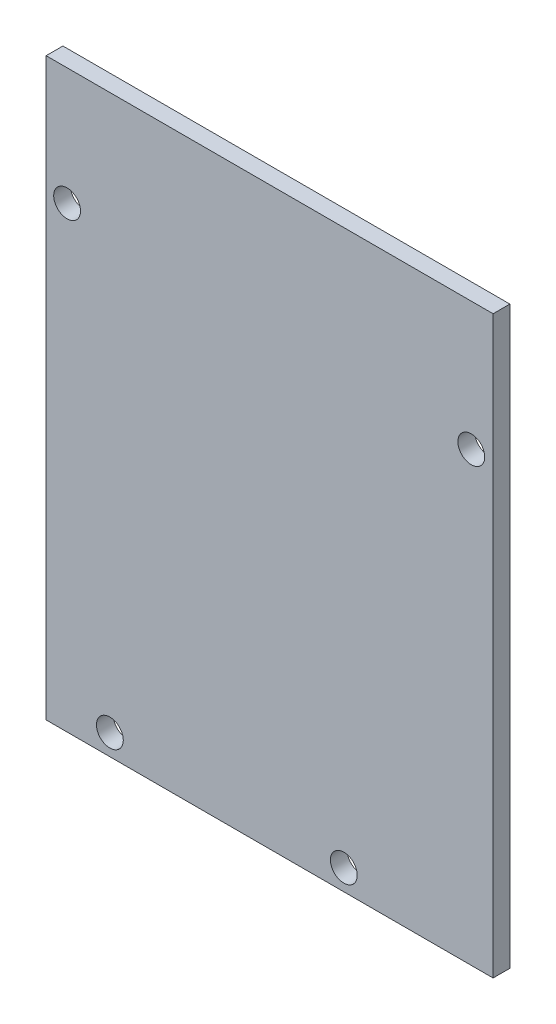
ISO-10303-21;
HEADER;
FILE_DESCRIPTION(('STEP AP214'),'2;1');
FILE_NAME('part.step','',(''),(''),'','','');
FILE_SCHEMA(('AUTOMOTIVE_DESIGN { 1 0 10303 214 1 1 1 1 }'));
ENDSEC;
DATA;
#1=APPLICATION_CONTEXT('core data for automotive mechanical design processes');
#2=APPLICATION_PROTOCOL_DEFINITION('international standard','automotive_design',2000,#1);
#3=PRODUCT_CONTEXT('',#1,'mechanical');
#4=PRODUCT('Part','Part','',(#3));
#5=PRODUCT_RELATED_PRODUCT_CATEGORY('part','',(#4));
#6=PRODUCT_DEFINITION_FORMATION('','',#4);
#7=PRODUCT_DEFINITION_CONTEXT('part definition',#1,'design');
#8=PRODUCT_DEFINITION('design','',#6,#7);
#9=PRODUCT_DEFINITION_SHAPE('','',#8);
#10=(LENGTH_UNIT() NAMED_UNIT(*) SI_UNIT(.MILLI.,.METRE.));
#11=(NAMED_UNIT(*) PLANE_ANGLE_UNIT() SI_UNIT($,.RADIAN.));
#12=(NAMED_UNIT(*) SI_UNIT($,.STERADIAN.) SOLID_ANGLE_UNIT());
#13=UNCERTAINTY_MEASURE_WITH_UNIT(LENGTH_MEASURE(1.E-05),#10,'distance_accuracy_value','');
#14=(GEOMETRIC_REPRESENTATION_CONTEXT(3) GLOBAL_UNCERTAINTY_ASSIGNED_CONTEXT((#13)) GLOBAL_UNIT_ASSIGNED_CONTEXT((#10,
#11,#12)) REPRESENTATION_CONTEXT('',''));
#15=CARTESIAN_POINT('',(0.,0.,0.));
#16=DIRECTION('',(0.,0.,1.));
#17=DIRECTION('',(1.,0.,0.));
#18=AXIS2_PLACEMENT_3D('',#15,#16,#17);
#19=CARTESIAN_POINT('',(-26.65,34.3,2.));
#20=DIRECTION('',(0.,0.,-1.));
#21=DIRECTION('',(-1.,0.,0.));
#22=AXIS2_PLACEMENT_3D('',#19,#20,#21);
#23=PLANE('',#22);
#24=CARTESIAN_POINT('',(24.05,19.,2.));
#25=DIRECTION('',(0.,0.,1.));
#26=DIRECTION('',(1.,0.,0.));
#27=AXIS2_PLACEMENT_3D('',#24,#25,#26);
#28=CIRCLE('',#27,1.6);
#29=CARTESIAN_POINT('',(25.65,19.,2.));
#30=VERTEX_POINT('',#29);
#31=EDGE_CURVE('E121',#30,#30,#28,.T.);
#32=ORIENTED_EDGE('',*,*,#31,.F.);
#33=EDGE_LOOP('',(#32));
#34=FACE_BOUND('',#33,.T.);
#35=CARTESIAN_POINT('',(-19.05,-31.8,2.));
#36=DIRECTION('',(0.,0.,1.));
#37=DIRECTION('',(1.,0.,0.));
#38=AXIS2_PLACEMENT_3D('',#35,#36,#37);
#39=CIRCLE('',#38,1.6);
#40=CARTESIAN_POINT('',(-17.45,-31.8,2.));
#41=VERTEX_POINT('',#40);
#42=EDGE_CURVE('E100',#41,#41,#39,.T.);
#43=ORIENTED_EDGE('',*,*,#42,.F.);
#44=EDGE_LOOP('',(#43));
#45=FACE_BOUND('',#44,.T.);
#46=DIRECTION('',(0.,-1.,0.));
#47=VECTOR('',#46,1.);
#48=CARTESIAN_POINT('',(-26.65,-34.3,2.));
#49=LINE('',#48,#47);
#50=CARTESIAN_POINT('',(-26.65,34.3,2.));
#51=VERTEX_POINT('',#50);
#52=CARTESIAN_POINT('',(-26.65,-34.3,2.));
#53=VERTEX_POINT('',#52);
#54=EDGE_CURVE('E85',#51,#53,#49,.T.);
#55=ORIENTED_EDGE('',*,*,#54,.T.);
#56=DIRECTION('',(1.,0.,0.));
#57=VECTOR('',#56,1.);
#58=CARTESIAN_POINT('',(-26.65,-34.3,2.));
#59=LINE('',#58,#57);
#60=CARTESIAN_POINT('',(26.65,-34.3,2.));
#61=VERTEX_POINT('',#60);
#62=EDGE_CURVE('E80',#53,#61,#59,.T.);
#63=ORIENTED_EDGE('',*,*,#62,.T.);
#64=DIRECTION('',(0.,1.,0.));
#65=VECTOR('',#64,1.);
#66=CARTESIAN_POINT('',(26.65,-34.3,2.));
#67=LINE('',#66,#65);
#68=CARTESIAN_POINT('',(26.65,34.3,2.));
#69=VERTEX_POINT('',#68);
#70=EDGE_CURVE('E83',#61,#69,#67,.T.);
#71=ORIENTED_EDGE('',*,*,#70,.T.);
#72=DIRECTION('',(-1.,0.,0.));
#73=VECTOR('',#72,1.);
#74=CARTESIAN_POINT('',(-26.65,34.3,2.));
#75=LINE('',#74,#73);
#76=EDGE_CURVE('E50',#69,#51,#75,.T.);
#77=ORIENTED_EDGE('',*,*,#76,.T.);
#78=EDGE_LOOP('',(#55,#63,#71,#77));
#79=FACE_BOUND('',#78,.T.);
#80=CARTESIAN_POINT('',(-24.15,20.3,2.));
#81=DIRECTION('',(0.,0.,1.));
#82=DIRECTION('',(1.,0.,0.));
#83=AXIS2_PLACEMENT_3D('',#80,#81,#82);
#84=CIRCLE('',#83,1.6);
#85=CARTESIAN_POINT('',(-22.55,20.3,2.));
#86=VERTEX_POINT('',#85);
#87=EDGE_CURVE('E115',#86,#86,#84,.T.);
#88=ORIENTED_EDGE('',*,*,#87,.F.);
#89=EDGE_LOOP('',(#88));
#90=FACE_BOUND('',#89,.T.);
#91=CARTESIAN_POINT('',(8.85,-31.8,2.));
#92=DIRECTION('',(0.,0.,1.));
#93=DIRECTION('',(1.,0.,0.));
#94=AXIS2_PLACEMENT_3D('',#91,#92,#93);
#95=CIRCLE('',#94,1.6);
#96=CARTESIAN_POINT('',(10.45,-31.8,2.));
#97=VERTEX_POINT('',#96);
#98=EDGE_CURVE('E127',#97,#97,#95,.T.);
#99=ORIENTED_EDGE('',*,*,#98,.F.);
#100=EDGE_LOOP('',(#99));
#101=FACE_BOUND('',#100,.T.);
#102=ADVANCED_FACE('F33',(#34,#45,#79,#90,#101),#23,.F.);
#103=CARTESIAN_POINT('',(-26.65,34.3,0.));
#104=DIRECTION('',(0.,0.,-1.));
#105=DIRECTION('',(-1.,0.,0.));
#106=AXIS2_PLACEMENT_3D('',#103,#104,#105);
#107=PLANE('',#106);
#108=CARTESIAN_POINT('',(24.05,19.,0.));
#109=DIRECTION('',(0.,0.,1.));
#110=DIRECTION('',(1.,0.,0.));
#111=AXIS2_PLACEMENT_3D('',#108,#109,#110);
#112=CIRCLE('',#111,1.6);
#113=CARTESIAN_POINT('',(25.65,19.,0.));
#114=VERTEX_POINT('',#113);
#115=EDGE_CURVE('E124',#114,#114,#112,.T.);
#116=ORIENTED_EDGE('',*,*,#115,.T.);
#117=EDGE_LOOP('',(#116));
#118=FACE_BOUND('',#117,.T.);
#119=CARTESIAN_POINT('',(-19.05,-31.8,0.));
#120=DIRECTION('',(0.,0.,1.));
#121=DIRECTION('',(1.,0.,0.));
#122=AXIS2_PLACEMENT_3D('',#119,#120,#121);
#123=CIRCLE('',#122,1.6);
#124=CARTESIAN_POINT('',(-17.45,-31.8,0.));
#125=VERTEX_POINT('',#124);
#126=EDGE_CURVE('E112',#125,#125,#123,.T.);
#127=ORIENTED_EDGE('',*,*,#126,.T.);
#128=EDGE_LOOP('',(#127));
#129=FACE_BOUND('',#128,.T.);
#130=DIRECTION('',(0.,-1.,0.));
#131=VECTOR('',#130,1.);
#132=CARTESIAN_POINT('',(-26.65,-34.3,0.));
#133=LINE('',#132,#131);
#134=CARTESIAN_POINT('',(-26.65,34.3,0.));
#135=VERTEX_POINT('',#134);
#136=CARTESIAN_POINT('',(-26.65,-34.3,0.));
#137=VERTEX_POINT('',#136);
#138=EDGE_CURVE('E97',#135,#137,#133,.T.);
#139=ORIENTED_EDGE('',*,*,#138,.F.);
#140=DIRECTION('',(-1.,0.,0.));
#141=VECTOR('',#140,1.);
#142=CARTESIAN_POINT('',(-26.65,34.3,0.));
#143=LINE('',#142,#141);
#144=CARTESIAN_POINT('',(26.65,34.3,0.));
#145=VERTEX_POINT('',#144);
#146=EDGE_CURVE('E73',#145,#135,#143,.T.);
#147=ORIENTED_EDGE('',*,*,#146,.F.);
#148=DIRECTION('',(0.,1.,0.));
#149=VECTOR('',#148,1.);
#150=CARTESIAN_POINT('',(26.65,-34.3,0.));
#151=LINE('',#150,#149);
#152=CARTESIAN_POINT('',(26.65,-34.3,0.));
#153=VERTEX_POINT('',#152);
#154=EDGE_CURVE('E67',#153,#145,#151,.T.);
#155=ORIENTED_EDGE('',*,*,#154,.F.);
#156=DIRECTION('',(1.,0.,0.));
#157=VECTOR('',#156,1.);
#158=CARTESIAN_POINT('',(-26.65,-34.3,0.));
#159=LINE('',#158,#157);
#160=EDGE_CURVE('E89',#137,#153,#159,.T.);
#161=ORIENTED_EDGE('',*,*,#160,.F.);
#162=EDGE_LOOP('',(#139,#147,#155,#161));
#163=FACE_BOUND('',#162,.T.);
#164=CARTESIAN_POINT('',(-24.15,20.3,0.));
#165=DIRECTION('',(0.,0.,1.));
#166=DIRECTION('',(1.,0.,0.));
#167=AXIS2_PLACEMENT_3D('',#164,#165,#166);
#168=CIRCLE('',#167,1.6);
#169=CARTESIAN_POINT('',(-22.55,20.3,0.));
#170=VERTEX_POINT('',#169);
#171=EDGE_CURVE('E118',#170,#170,#168,.T.);
#172=ORIENTED_EDGE('',*,*,#171,.T.);
#173=EDGE_LOOP('',(#172));
#174=FACE_BOUND('',#173,.T.);
#175=CARTESIAN_POINT('',(8.85,-31.8,0.));
#176=DIRECTION('',(0.,0.,1.));
#177=DIRECTION('',(1.,0.,0.));
#178=AXIS2_PLACEMENT_3D('',#175,#176,#177);
#179=CIRCLE('',#178,1.6);
#180=CARTESIAN_POINT('',(10.45,-31.8,0.));
#181=VERTEX_POINT('',#180);
#182=EDGE_CURVE('E130',#181,#181,#179,.T.);
#183=ORIENTED_EDGE('',*,*,#182,.T.);
#184=EDGE_LOOP('',(#183));
#185=FACE_BOUND('',#184,.T.);
#186=ADVANCED_FACE('F108',(#118,#129,#163,#174,#185),#107,.T.);
#187=CARTESIAN_POINT('',(-26.65,-34.3,2.));
#188=DIRECTION('',(1.,0.,0.));
#189=DIRECTION('',(0.,0.,-1.));
#190=AXIS2_PLACEMENT_3D('',#187,#188,#189);
#191=PLANE('',#190);
#192=ORIENTED_EDGE('',*,*,#138,.T.);
#193=DIRECTION('',(0.,0.,-1.));
#194=VECTOR('',#193,1.);
#195=CARTESIAN_POINT('',(-26.65,-34.3,2.));
#196=LINE('',#195,#194);
#197=EDGE_CURVE('E11',#53,#137,#196,.T.);
#198=ORIENTED_EDGE('',*,*,#197,.F.);
#199=ORIENTED_EDGE('',*,*,#54,.F.);
#200=DIRECTION('',(0.,0.,-1.));
#201=VECTOR('',#200,1.);
#202=CARTESIAN_POINT('',(-26.65,34.3,2.));
#203=LINE('',#202,#201);
#204=EDGE_CURVE('E93',#51,#135,#203,.T.);
#205=ORIENTED_EDGE('',*,*,#204,.T.);
#206=EDGE_LOOP('',(#192,#198,#199,#205));
#207=FACE_BOUND('',#206,.T.);
#208=ADVANCED_FACE('F35',(#207),#191,.F.);
#209=CARTESIAN_POINT('',(-26.65,-34.3,2.));
#210=DIRECTION('',(0.,1.,0.));
#211=DIRECTION('',(0.,0.,1.));
#212=AXIS2_PLACEMENT_3D('',#209,#210,#211);
#213=PLANE('',#212);
#214=ORIENTED_EDGE('',*,*,#160,.T.);
#215=DIRECTION('',(0.,0.,-1.));
#216=VECTOR('',#215,1.);
#217=CARTESIAN_POINT('',(26.65,-34.3,2.));
#218=LINE('',#217,#216);
#219=EDGE_CURVE('E42',#61,#153,#218,.T.);
#220=ORIENTED_EDGE('',*,*,#219,.F.);
#221=ORIENTED_EDGE('',*,*,#62,.F.);
#222=ORIENTED_EDGE('',*,*,#197,.T.);
#223=EDGE_LOOP('',(#214,#220,#221,#222));
#224=FACE_BOUND('',#223,.T.);
#225=ADVANCED_FACE('F88',(#224),#213,.F.);
#226=CARTESIAN_POINT('',(26.65,-34.3,2.));
#227=DIRECTION('',(-1.,0.,0.));
#228=DIRECTION('',(0.,0.,1.));
#229=AXIS2_PLACEMENT_3D('',#226,#227,#228);
#230=PLANE('',#229);
#231=ORIENTED_EDGE('',*,*,#154,.T.);
#232=DIRECTION('',(0.,0.,-1.));
#233=VECTOR('',#232,1.);
#234=CARTESIAN_POINT('',(26.65,34.3,2.));
#235=LINE('',#234,#233);
#236=EDGE_CURVE('E90',#69,#145,#235,.T.);
#237=ORIENTED_EDGE('',*,*,#236,.F.);
#238=ORIENTED_EDGE('',*,*,#70,.F.);
#239=ORIENTED_EDGE('',*,*,#219,.T.);
#240=EDGE_LOOP('',(#231,#237,#238,#239));
#241=FACE_BOUND('',#240,.T.);
#242=ADVANCED_FACE('F91',(#241),#230,.F.);
#243=CARTESIAN_POINT('',(-26.65,34.3,2.));
#244=DIRECTION('',(0.,-1.,0.));
#245=DIRECTION('',(0.,0.,-1.));
#246=AXIS2_PLACEMENT_3D('',#243,#244,#245);
#247=PLANE('',#246);
#248=ORIENTED_EDGE('',*,*,#146,.T.);
#249=ORIENTED_EDGE('',*,*,#204,.F.);
#250=ORIENTED_EDGE('',*,*,#76,.F.);
#251=ORIENTED_EDGE('',*,*,#236,.T.);
#252=EDGE_LOOP('',(#248,#249,#250,#251));
#253=FACE_BOUND('',#252,.T.);
#254=ADVANCED_FACE('F105',(#253),#247,.F.);
#255=CARTESIAN_POINT('',(-19.05,-31.8,2.));
#256=DIRECTION('',(0.,0.,-1.));
#257=DIRECTION('',(-1.,0.,0.));
#258=AXIS2_PLACEMENT_3D('',#255,#256,#257);
#259=CYLINDRICAL_SURFACE('',#258,1.6);
#260=ORIENTED_EDGE('',*,*,#42,.T.);
#261=EDGE_LOOP('',(#260));
#262=FACE_BOUND('',#261,.T.);
#263=ORIENTED_EDGE('',*,*,#126,.F.);
#264=EDGE_LOOP('',(#263));
#265=FACE_BOUND('',#264,.T.);
#266=ADVANCED_FACE('F150',(#262,#265),#259,.F.);
#267=CARTESIAN_POINT('',(-24.15,20.3,2.));
#268=DIRECTION('',(0.,0.,-1.));
#269=DIRECTION('',(-1.,0.,0.));
#270=AXIS2_PLACEMENT_3D('',#267,#268,#269);
#271=CYLINDRICAL_SURFACE('',#270,1.6);
#272=ORIENTED_EDGE('',*,*,#87,.T.);
#273=EDGE_LOOP('',(#272));
#274=FACE_BOUND('',#273,.T.);
#275=ORIENTED_EDGE('',*,*,#171,.F.);
#276=EDGE_LOOP('',(#275));
#277=FACE_BOUND('',#276,.T.);
#278=ADVANCED_FACE('F196',(#274,#277),#271,.F.);
#279=CARTESIAN_POINT('',(24.05,19.,2.));
#280=DIRECTION('',(0.,0.,-1.));
#281=DIRECTION('',(-1.,0.,0.));
#282=AXIS2_PLACEMENT_3D('',#279,#280,#281);
#283=CYLINDRICAL_SURFACE('',#282,1.6);
#284=ORIENTED_EDGE('',*,*,#31,.T.);
#285=EDGE_LOOP('',(#284));
#286=FACE_BOUND('',#285,.T.);
#287=ORIENTED_EDGE('',*,*,#115,.F.);
#288=EDGE_LOOP('',(#287));
#289=FACE_BOUND('',#288,.T.);
#290=ADVANCED_FACE('F204',(#286,#289),#283,.F.);
#291=CARTESIAN_POINT('',(8.85,-31.8,2.));
#292=DIRECTION('',(0.,0.,-1.));
#293=DIRECTION('',(-1.,0.,0.));
#294=AXIS2_PLACEMENT_3D('',#291,#292,#293);
#295=CYLINDRICAL_SURFACE('',#294,1.6);
#296=ORIENTED_EDGE('',*,*,#98,.T.);
#297=EDGE_LOOP('',(#296));
#298=FACE_BOUND('',#297,.T.);
#299=ORIENTED_EDGE('',*,*,#182,.F.);
#300=EDGE_LOOP('',(#299));
#301=FACE_BOUND('',#300,.T.);
#302=ADVANCED_FACE('F136',(#298,#301),#295,.F.);
#303=CLOSED_SHELL('',(#102,#186,#208,#225,#242,#254,#266,#278,#290,#302));
#304=MANIFOLD_SOLID_BREP('B2',#303);
#305=ADVANCED_BREP_SHAPE_REPRESENTATION('',(#18,#304),#14);
#306=SHAPE_DEFINITION_REPRESENTATION(#9,#305);
ENDSEC;
END-ISO-10303-21;
